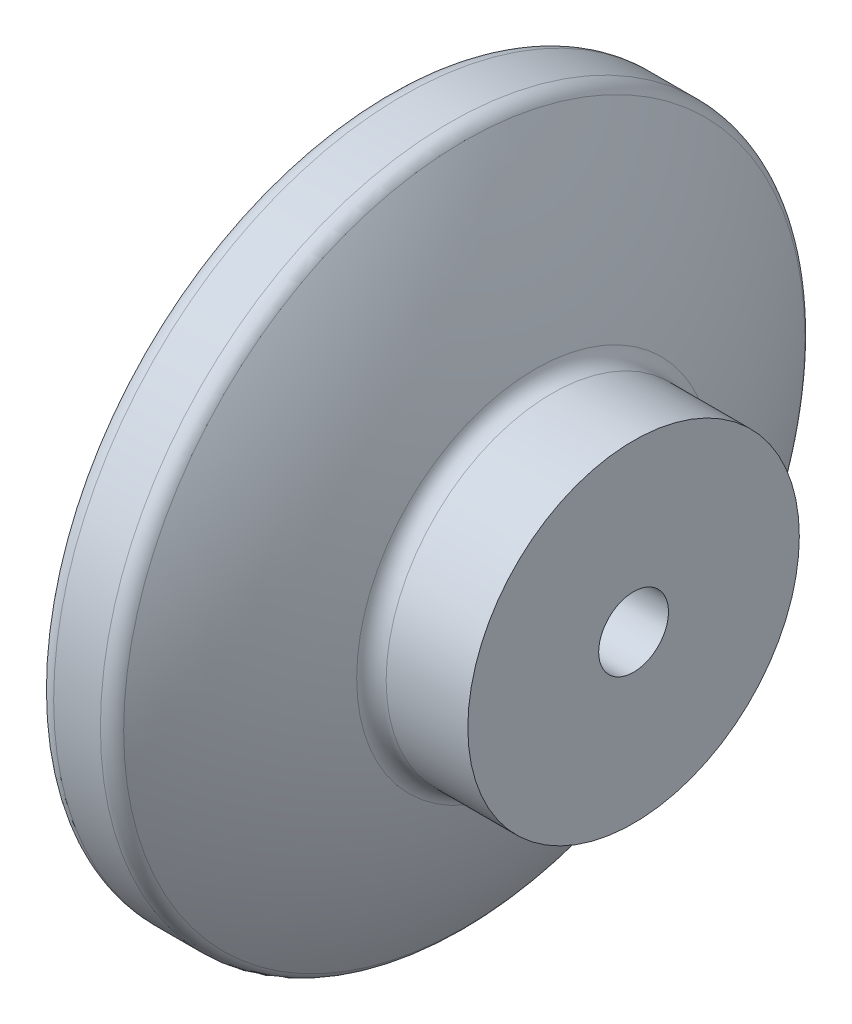
ISO-10303-21;
HEADER;
FILE_DESCRIPTION(('STEP AP214'),'2;1');
FILE_NAME('part.step','',(''),(''),'','','');
FILE_SCHEMA(('AUTOMOTIVE_DESIGN { 1 0 10303 214 1 1 1 1 }'));
ENDSEC;
DATA;
#1=APPLICATION_CONTEXT('core data for automotive mechanical design processes');
#2=APPLICATION_PROTOCOL_DEFINITION('international standard','automotive_design',2000,#1);
#3=PRODUCT_CONTEXT('',#1,'mechanical');
#4=PRODUCT('Part','Part','',(#3));
#5=PRODUCT_RELATED_PRODUCT_CATEGORY('part','',(#4));
#6=PRODUCT_DEFINITION_FORMATION('','',#4);
#7=PRODUCT_DEFINITION_CONTEXT('part definition',#1,'design');
#8=PRODUCT_DEFINITION('design','',#6,#7);
#9=PRODUCT_DEFINITION_SHAPE('','',#8);
#10=(LENGTH_UNIT() NAMED_UNIT(*) SI_UNIT(.MILLI.,.METRE.));
#11=(NAMED_UNIT(*) PLANE_ANGLE_UNIT() SI_UNIT($,.RADIAN.));
#12=(NAMED_UNIT(*) SI_UNIT($,.STERADIAN.) SOLID_ANGLE_UNIT());
#13=UNCERTAINTY_MEASURE_WITH_UNIT(LENGTH_MEASURE(1.E-05),#10,'distance_accuracy_value','');
#14=(GEOMETRIC_REPRESENTATION_CONTEXT(3) GLOBAL_UNCERTAINTY_ASSIGNED_CONTEXT((#13)) GLOBAL_UNIT_ASSIGNED_CONTEXT((#10,
#11,#12)) REPRESENTATION_CONTEXT('',''));
#15=CARTESIAN_POINT('',(0.,0.,0.));
#16=DIRECTION('',(0.,0.,1.));
#17=DIRECTION('',(1.,0.,0.));
#18=AXIS2_PLACEMENT_3D('',#15,#16,#17);
#19=CARTESIAN_POINT('',(-10.,0.,0.));
#20=DIRECTION('',(-1.,0.,0.));
#21=DIRECTION('',(0.,1.,0.));
#22=AXIS2_PLACEMENT_3D('',#19,#20,#21);
#23=SPHERICAL_SURFACE('',#22,75.);
#24=CARTESIAN_POINT('',(55.23065837761,0.,0.));
#25=DIRECTION('',(-1.,0.,0.));
#26=DIRECTION('',(0.,0.,1.));
#27=AXIS2_PLACEMENT_3D('',#24,#25,#26);
#28=CIRCLE('',#27,37.012987012987);
#29=CARTESIAN_POINT('',(55.23065837761,37.012987012987,0.));
#30=VERTEX_POINT('',#29);
#31=EDGE_CURVE('E10',#30,#30,#28,.T.);
#32=CARTESIAN_POINT('',(64.5721127500087,0.,0.));
#33=DIRECTION('',(-1.,0.,0.));
#34=DIRECTION('',(0.,0.,1.));
#35=AXIS2_PLACEMENT_3D('',#32,#33,#34);
#36=CIRCLE('',#35,8.);
#37=CARTESIAN_POINT('',(64.5721127500087,7.9999999999999,0.));
#38=VERTEX_POINT('',#37);
#39=EDGE_CURVE('E43',#38,#38,#36,.F.);
#40=CARTESIAN_POINT('',(55.23065837761,37.012987012987,0.));
#41=CARTESIAN_POINT('',(55.3884443950413,36.7349095697746,0.));
#42=CARTESIAN_POINT('',(55.5444520445442,36.4558230533568,0.));
#43=CARTESIAN_POINT('',(55.8528855538291,35.8956777746089,0.));
#44=CARTESIAN_POINT('',(56.0053114136109,35.6146190122787,0.));
#45=CARTESIAN_POINT('',(56.3065562895893,35.0505751422047,0.));
#46=CARTESIAN_POINT('',(56.4553753057859,34.7675900344608,0.));
#47=CARTESIAN_POINT('',(56.7493821876181,34.1997397755547,0.));
#48=CARTESIAN_POINT('',(56.8945700532538,33.9148746243924,0.));
#49=CARTESIAN_POINT('',(57.1812908788231,33.3433108649767,0.));
#50=CARTESIAN_POINT('',(57.3228238387566,33.0566122567231,0.));
#51=CARTESIAN_POINT('',(57.6022117068295,32.481428475529,0.));
#52=CARTESIAN_POINT('',(57.7400666149688,32.1929433025884,0.));
#53=CARTESIAN_POINT('',(58.0120758319065,31.6142335749641,0.));
#54=CARTESIAN_POINT('',(58.1462301407049,31.3240090202803,0.));
#55=CARTESIAN_POINT('',(58.410816217476,30.7418679970441,0.));
#56=CARTESIAN_POINT('',(58.5412479854487,30.4499515284916,0.));
#57=CARTESIAN_POINT('',(58.7983676477084,29.8644744219946,0.));
#58=CARTESIAN_POINT('',(58.9250555419954,29.5709137840501,0.));
#59=CARTESIAN_POINT('',(59.1746667364122,28.9821963521905,0.));
#60=CARTESIAN_POINT('',(59.297590036542,28.6870395582753,0.));
#61=CARTESIAN_POINT('',(59.5396519378772,28.0951780889472,0.));
#62=CARTESIAN_POINT('',(59.6587905390826,27.7984734135342,0.));
#63=CARTESIAN_POINT('',(59.8932635568133,27.2035647088495,0.));
#64=CARTESIAN_POINT('',(60.0085979733387,26.9053606795778,0.));
#65=CARTESIAN_POINT('',(60.2354437581477,26.3075020400419,0.));
#66=CARTESIAN_POINT('',(60.3469551264314,26.0078474297777,0.));
#67=CARTESIAN_POINT('',(60.5661365764754,25.4071366383731,0.));
#68=CARTESIAN_POINT('',(60.6738066582358,25.1060804572327,0.));
#69=CARTESIAN_POINT('',(60.8852879252149,24.5026157634268,0.));
#70=CARTESIAN_POINT('',(60.9890991104335,24.2002072507612,0.));
#71=CARTESIAN_POINT('',(61.1928456054536,23.5940873544367,0.));
#72=CARTESIAN_POINT('',(61.292780915255,23.2903759707778,0.));
#73=CARTESIAN_POINT('',(61.4887593144857,22.6817000060903,0.));
#74=CARTESIAN_POINT('',(61.5848024039149,22.3767354250616,0.));
#75=CARTESIAN_POINT('',(61.7729806540392,21.765602944225,0.));
#76=CARTESIAN_POINT('',(61.8651158147344,21.4594350444171,0.));
#77=CARTESIAN_POINT('',(62.0454631381917,20.8459460014219,0.));
#78=CARTESIAN_POINT('',(62.1336753009539,20.5386248582346,0.));
#79=CARTESIAN_POINT('',(62.3061622009736,19.9228795924997,0.));
#80=CARTESIAN_POINT('',(62.3904369382311,19.6144554699521,0.));
#81=CARTESIAN_POINT('',(62.5550352036567,18.9965546899135,0.));
#82=CARTESIAN_POINT('',(62.6353587318248,18.6870780324227,0.));
#83=CARTESIAN_POINT('',(62.7920414417287,18.0671227990626,0.));
#84=CARTESIAN_POINT('',(62.8684006234644,17.7566442231934,0.));
#85=CARTESIAN_POINT('',(63.0171421515494,17.1347359335105,0.));
#86=CARTESIAN_POINT('',(63.0895244978986,16.8233062196969,0.));
#87=CARTESIAN_POINT('',(63.2303005166939,16.1995465901233,0.));
#88=CARTESIAN_POINT('',(63.2986941891399,15.8872166743634,0.));
#89=CARTESIAN_POINT('',(63.4314816739633,15.2617077241262,0.));
#90=CARTESIAN_POINT('',(63.4958754863408,14.9485286896489,0.));
#91=CARTESIAN_POINT('',(63.6206527191261,14.3213727240915,0.));
#92=CARTESIAN_POINT('',(63.681036139534,14.0073957930115,0.));
#93=CARTESIAN_POINT('',(63.7977827121546,13.3786953868343,0.));
#94=CARTESIAN_POINT('',(63.8541458643673,13.0639719117371,0.));
#95=CARTESIAN_POINT('',(63.9628426828254,12.4338298923223,0.));
#96=CARTESIAN_POINT('',(64.0151763490709,12.1184113480048,0.));
#97=CARTESIAN_POINT('',(64.1158056334436,11.4869307782172,0.));
#98=CARTESIAN_POINT('',(64.1641012515709,11.1708687527471,0.));
#99=CARTESIAN_POINT('',(64.2566465507746,10.5381529155028,0.));
#100=CARTESIAN_POINT('',(64.300896231851,10.2214991037286,0.));
#101=CARTESIAN_POINT('',(64.3853423820833,9.58765147978233,0.));
#102=CARTESIAN_POINT('',(64.4255388512391,9.27045766761034,0.));
#103=CARTESIAN_POINT('',(64.5018721435973,8.63558193848603,0.));
#104=CARTESIAN_POINT('',(64.5380089667996,8.31790002153371,0.));
#105=CARTESIAN_POINT('',(64.5721127500087,7.9999999999999,0.));
#106=B_SPLINE_CURVE_WITH_KNOTS('',3,(#40,#41,#42,#43,#44,#45,#46,#47,#48,#49,#50,#51,#52,#53,
#54,#55,#56,#57,#58,#59,#60,#61,#62,#63,#64,#65,#66,#67,#68,#69,#70,#71,#72,#73,#74,#75,#76,#77,
#78,#79,#80,#81,#82,#83,#84,#85,#86,#87,#88,#89,#90,#91,#92,#93,#94,#95,#96,#97,#98,#99,#100,
#101,#102,#103,#104,#105),.UNSPECIFIED.,.F.,.F.,(4,2,2,2,2,2,2,2,2,2,2,2,2,2,2,2,2,2,2,2,2,2,2,
2,2,2,2,2,2,2,2,2,4),(0.,0.959165719475215,1.91833143895044,2.87749715842563,3.83666287790085,
4.79582859737606,5.75499431685126,6.71416003632647,7.67332575580169,8.63249147527691,
9.59165719475212,10.5508229142273,11.5099886337025,12.4691543531777,13.4283200726529,
14.3874857921282,15.3466515116034,16.3058172310786,17.2649829505538,18.224148670029,
19.1833143895042,20.1424801089794,21.1016458284546,22.0608115479298,23.0199772674051,
23.9791429868803,24.9383087063555,25.8974744258307,26.8566401453059,27.8158058647811,
28.7749715842563,29.7341373037315,30.6933030232067),.UNSPECIFIED.);
#107=EDGE_CURVE('BSEAM39',#30,#38,#106,.T.);
#108=ORIENTED_EDGE('',*,*,#31,.T.);
#109=ORIENTED_EDGE('',*,*,#39,.T.);
#110=ORIENTED_EDGE('',*,*,#107,.T.);
#111=ORIENTED_EDGE('',*,*,#107,.F.);
#112=EDGE_LOOP('',(#108,#110,#109,#111));
#113=FACE_BOUND('',#112,.T.);
#114=ADVANCED_FACE('F39',(#113),#23,.F.);
#115=CARTESIAN_POINT('',(0.,0.,0.));
#116=DIRECTION('',(-1.,0.,0.));
#117=DIRECTION('',(0.,1.,0.));
#118=AXIS2_PLACEMENT_3D('',#115,#116,#117);
#119=SPHERICAL_SURFACE('',#118,75.);
#120=CARTESIAN_POINT('',(72.1568539381252,0.,0.));
#121=DIRECTION('',(-1.,0.,0.));
#122=DIRECTION('',(0.,0.,1.));
#123=AXIS2_PLACEMENT_3D('',#120,#121,#122);
#124=CIRCLE('',#123,20.4545454545455);
#125=CARTESIAN_POINT('',(72.1568539381252,20.4545454545454,0.));
#126=VERTEX_POINT('',#125);
#127=EDGE_CURVE('E83',#126,#126,#124,.T.);
#128=CARTESIAN_POINT('',(64.0374330503319,0.,0.));
#129=DIRECTION('',(-1.,0.,0.));
#130=DIRECTION('',(0.,0.,1.));
#131=AXIS2_PLACEMENT_3D('',#128,#129,#130);
#132=CIRCLE('',#131,39.041095890411);
#133=CARTESIAN_POINT('',(64.0374330503319,39.041095890411,0.));
#134=VERTEX_POINT('',#133);
#135=EDGE_CURVE('E79',#134,#134,#132,.F.);
#136=CARTESIAN_POINT('',(72.1568539381252,20.4545454545454,0.));
#137=CARTESIAN_POINT('',(72.0990558192341,20.6584381379828,0.));
#138=CARTESIAN_POINT('',(72.0403934513344,20.8620858295005,0.));
#139=CARTESIAN_POINT('',(71.9213445307203,21.2688766231451,0.));
#140=CARTESIAN_POINT('',(71.8609579780058,21.4720197252719,0.));
#141=CARTESIAN_POINT('',(71.7384650009643,21.8777867345826,0.));
#142=CARTESIAN_POINT('',(71.6763585766372,22.0804106417665,0.));
#143=CARTESIAN_POINT('',(71.5504303263619,22.4851247026648,0.));
#144=CARTESIAN_POINT('',(71.4866085004136,22.6872148563792,0.));
#145=CARTESIAN_POINT('',(71.3572540312604,23.0908468875639,0.));
#146=CARTESIAN_POINT('',(71.2917213880555,23.2923887650343,0.));
#147=CARTESIAN_POINT('',(71.1589499940771,23.6949097610534,0.));
#148=CARTESIAN_POINT('',(71.0917112433035,23.8958888796022,0.));
#149=CARTESIAN_POINT('',(70.9555324658379,24.2972699153534,0.));
#150=CARTESIAN_POINT('',(70.8865924391459,24.4976718325559,0.));
#151=CARTESIAN_POINT('',(70.7470160639186,24.8978840647177,0.));
#152=CARTESIAN_POINT('',(70.6763797153834,25.0976943796771,0.));
#153=CARTESIAN_POINT('',(70.5334157723972,25.4967090489553,0.));
#154=CARTESIAN_POINT('',(70.4610881779461,25.695913403274,0.));
#155=CARTESIAN_POINT('',(70.314746940601,26.0937018364212,0.));
#156=CARTESIAN_POINT('',(70.2407332977069,26.2922859152496,0.));
#157=CARTESIAN_POINT('',(70.0910252821048,26.6888195271387,0.));
#158=CARTESIAN_POINT('',(70.0153309093968,26.8867690601994,0.));
#159=CARTESIAN_POINT('',(69.8622668735744,27.2820193558744,0.));
#160=CARTESIAN_POINT('',(69.7848972104599,27.4793201184886,0.));
#161=CARTESIAN_POINT('',(69.6284881536184,27.8732586952126,0.));
#162=CARTESIAN_POINT('',(69.5494487598914,28.0698965093224,0.));
#163=CARTESIAN_POINT('',(69.3897059216057,28.462495058619,0.));
#164=CARTESIAN_POINT('',(69.309002477047,28.6584557938058,0.));
#165=CARTESIAN_POINT('',(69.1459373364578,29.0496861034931,0.));
#166=CARTESIAN_POINT('',(69.0635756404273,29.2449556779935,0.));
#167=CARTESIAN_POINT('',(68.8971999154165,29.6347896342114,0.));
#168=CARTESIAN_POINT('',(68.8131858864362,29.8293540159289,0.));
#169=CARTESIAN_POINT('',(68.6435115327846,30.2177636051595,0.));
#170=CARTESIAN_POINT('',(68.5578512081133,30.4116088126726,0.));
#171=CARTESIAN_POINT('',(68.3848904186417,30.7985661237532,0.));
#172=CARTESIAN_POINT('',(68.2975899538413,30.9916782273207,0.));
#173=CARTESIAN_POINT('',(68.1213551575341,31.3771554534494,0.));
#174=CARTESIAN_POINT('',(68.0324208260272,31.5695205760107,0.));
#175=CARTESIAN_POINT('',(67.8529246871394,31.9534900167449,0.));
#176=CARTESIAN_POINT('',(67.7623628797584,32.1450943349178,0.));
#177=CARTESIAN_POINT('',(67.5796182969055,32.5275283981644,0.));
#178=CARTESIAN_POINT('',(67.4874355214335,32.718358143238,0.));
#179=CARTESIAN_POINT('',(67.3014556266644,33.0992293472363,0.));
#180=CARTESIAN_POINT('',(67.2076585073675,33.2892708061609,0.));
#181=CARTESIAN_POINT('',(67.0184566652213,33.6685517814574,0.));
#182=CARTESIAN_POINT('',(66.9230519423722,33.8577912978293,0.));
#183=CARTESIAN_POINT('',(66.7306417489179,34.2354547892449,0.));
#184=CARTESIAN_POINT('',(66.6336362783127,34.4238787642887,0.));
#185=CARTESIAN_POINT('',(66.4380315601697,34.7998976328758,0.));
#186=CARTESIAN_POINT('',(66.3394323126318,34.9874925264191,0.));
#187=CARTESIAN_POINT('',(66.1406471259864,35.3618397514174,0.));
#188=CARTESIAN_POINT('',(66.0404611868789,35.5485920828724,0.));
#189=CARTESIAN_POINT('',(65.8385098164364,35.9212407636283,0.));
#190=CARTESIAN_POINT('',(65.7367443851014,36.1071371129292,0.));
#191=CARTESIAN_POINT('',(65.5316413432014,36.4780604709139,0.));
#192=CARTESIAN_POINT('',(65.4283037326364,36.6630874795975,0.));
#193=CARTESIAN_POINT('',(65.22006375768,37.0322588600137,0.));
#194=CARTESIAN_POINT('',(65.1151613932886,37.2164032317462,0.));
#195=CARTESIAN_POINT('',(64.9037994506576,37.5837961066273,0.));
#196=CARTESIAN_POINT('',(64.797339872418,37.767044609776,0.));
#197=CARTESIAN_POINT('',(64.582871146016,38.1326325754764,0.));
#198=CARTESIAN_POINT('',(64.4748619978536,38.3149720380281,0.));
#199=CARTESIAN_POINT('',(64.2573019165704,38.678728833601,0.));
#200=CARTESIAN_POINT('',(64.1477509834496,38.8601461666221,0.));
#201=CARTESIAN_POINT('',(64.0374330503319,39.041095890411,0.));
#202=B_SPLINE_CURVE_WITH_KNOTS('',3,(#136,#137,#138,#139,#140,#141,#142,#143,#144,#145,#146,
#147,#148,#149,#150,#151,#152,#153,#154,#155,#156,#157,#158,#159,#160,#161,#162,#163,#164,#165,
#166,#167,#168,#169,#170,#171,#172,#173,#174,#175,#176,#177,#178,#179,#180,#181,#182,#183,#184,
#185,#186,#187,#188,#189,#190,#191,#192,#193,#194,#195,#196,#197,#198,#199,#200,#201),
.UNSPECIFIED.,.F.,.F.,(4,2,2,2,2,2,2,2,2,2,2,2,2,2,2,2,2,2,2,2,2,2,2,2,2,2,2,2,2,2,2,2,4),(0.,
0.635777648901161,1.27155529780232,1.90733294670348,2.54311059560464,3.17888824450581,
3.81466589340697,4.45044354230813,5.08622119120929,5.72199884011044,6.3577764890116,
6.99355413791276,7.62933178681392,8.26510943571509,8.90088708461625,9.53666473351741,
10.1724423824186,10.8082200313197,11.4439976802209,12.0797753291221,12.7155529780232,
13.3513306269244,13.9871082758255,14.6228859247267,15.2586635736279,15.894441222529,
16.5302188714302,17.1659965203313,17.8017741692325,18.4375518181337,19.0733294670348,
19.709107115936,20.3448847648372),.UNSPECIFIED.);
#203=EDGE_CURVE('BSEAM110',#126,#134,#202,.T.);
#204=ORIENTED_EDGE('',*,*,#127,.T.);
#205=ORIENTED_EDGE('',*,*,#135,.T.);
#206=ORIENTED_EDGE('',*,*,#203,.T.);
#207=ORIENTED_EDGE('',*,*,#203,.F.);
#208=EDGE_LOOP('',(#204,#206,#205,#207));
#209=FACE_BOUND('',#208,.T.);
#210=ADVANCED_FACE('F110',(#209),#119,.T.);
#211=CARTESIAN_POINT('',(-75.,0.,0.));
#212=DIRECTION('',(-1.,0.,0.));
#213=DIRECTION('',(0.,0.,1.));
#214=AXIS2_PLACEMENT_3D('',#211,#212,#213);
#215=CYLINDRICAL_SURFACE('',#214,40.);
#216=CARTESIAN_POINT('',(62.3297681689897,0.,0.));
#217=DIRECTION('',(-1.,0.,0.));
#218=DIRECTION('',(0.,0.,1.));
#219=AXIS2_PLACEMENT_3D('',#216,#217,#218);
#220=CIRCLE('',#219,40.);
#221=CARTESIAN_POINT('',(62.3297681689897,0.,40.));
#222=VERTEX_POINT('',#221);
#223=EDGE_CURVE('E48',#222,#222,#220,.T.);
#224=ORIENTED_EDGE('',*,*,#223,.T.);
#225=EDGE_LOOP('',(#224));
#226=FACE_BOUND('',#225,.T.);
#227=CARTESIAN_POINT('',(56.9701426010129,0.,0.));
#228=DIRECTION('',(-1.,0.,0.));
#229=DIRECTION('',(0.,0.,1.));
#230=AXIS2_PLACEMENT_3D('',#227,#228,#229);
#231=CIRCLE('',#230,40.);
#232=CARTESIAN_POINT('',(56.9701426010129,0.,40.));
#233=VERTEX_POINT('',#232);
#234=EDGE_CURVE('E54',#233,#233,#231,.F.);
#235=ORIENTED_EDGE('',*,*,#234,.T.);
#236=EDGE_LOOP('',(#235));
#237=FACE_BOUND('',#236,.T.);
#238=ADVANCED_FACE('F94',(#226,#237),#215,.T.);
#239=CARTESIAN_POINT('',(-75.,0.,0.));
#240=DIRECTION('',(-1.,0.,0.));
#241=DIRECTION('',(0.,0.,1.));
#242=AXIS2_PLACEMENT_3D('',#239,#240,#241);
#243=CYLINDRICAL_SURFACE('',#242,4.);
#244=CARTESIAN_POINT('',(70.,0.,0.));
#245=DIRECTION('',(1.,0.,0.));
#246=DIRECTION('',(0.,0.,-1.));
#247=AXIS2_PLACEMENT_3D('',#244,#245,#246);
#248=CIRCLE('',#247,4.);
#249=CARTESIAN_POINT('',(70.,0.,-4.));
#250=VERTEX_POINT('',#249);
#251=EDGE_CURVE('E57',#250,#250,#248,.F.);
#252=ORIENTED_EDGE('',*,*,#251,.T.);
#253=EDGE_LOOP('',(#252));
#254=FACE_BOUND('',#253,.T.);
#255=CARTESIAN_POINT('',(83.4428877022476,0.,0.));
#256=DIRECTION('',(-1.,0.,0.));
#257=DIRECTION('',(0.,0.,1.));
#258=AXIS2_PLACEMENT_3D('',#255,#256,#257);
#259=CIRCLE('',#258,4.);
#260=CARTESIAN_POINT('',(83.4428877022476,0.,4.));
#261=VERTEX_POINT('',#260);
#262=EDGE_CURVE('E75',#261,#261,#259,.T.);
#263=ORIENTED_EDGE('',*,*,#262,.F.);
#264=EDGE_LOOP('',(#263));
#265=FACE_BOUND('',#264,.T.);
#266=ADVANCED_FACE('F120',(#254,#265),#243,.F.);
#267=CARTESIAN_POINT('',(83.4428877022476,1.54400358613744E-13,0.));
#268=DIRECTION('',(-1.,0.,0.));
#269=DIRECTION('',(0.,0.,1.));
#270=AXIS2_PLACEMENT_3D('',#267,#268,#269);
#271=PLANE('',#270);
#272=CARTESIAN_POINT('',(83.4428877022476,0.,0.));
#273=DIRECTION('',(-1.,0.,0.));
#274=DIRECTION('',(0.,0.,1.));
#275=AXIS2_PLACEMENT_3D('',#272,#273,#274);
#276=CIRCLE('',#275,19.);
#277=CARTESIAN_POINT('',(83.4428877022476,0.,19.));
#278=VERTEX_POINT('',#277);
#279=EDGE_CURVE('E66',#278,#278,#276,.T.);
#280=ORIENTED_EDGE('',*,*,#279,.F.);
#281=EDGE_LOOP('',(#280));
#282=FACE_BOUND('',#281,.T.);
#283=ORIENTED_EDGE('',*,*,#262,.T.);
#284=EDGE_LOOP('',(#283));
#285=FACE_BOUND('',#284,.T.);
#286=ADVANCED_FACE('F131',(#282,#285),#271,.F.);
#287=CARTESIAN_POINT('',(-75.,0.,0.));
#288=DIRECTION('',(-1.,0.,0.));
#289=DIRECTION('',(0.,0.,1.));
#290=AXIS2_PLACEMENT_3D('',#287,#288,#289);
#291=CYLINDRICAL_SURFACE('',#290,19.);
#292=CARTESIAN_POINT('',(74.0810367098086,0.,0.));
#293=DIRECTION('',(-1.,0.,0.));
#294=DIRECTION('',(0.,0.,1.));
#295=AXIS2_PLACEMENT_3D('',#292,#293,#294);
#296=CIRCLE('',#295,19.);
#297=CARTESIAN_POINT('',(74.0810367098086,0.,19.));
#298=VERTEX_POINT('',#297);
#299=EDGE_CURVE('E87',#298,#298,#296,.F.);
#300=ORIENTED_EDGE('',*,*,#299,.T.);
#301=EDGE_LOOP('',(#300));
#302=FACE_BOUND('',#301,.T.);
#303=ORIENTED_EDGE('',*,*,#279,.T.);
#304=EDGE_LOOP('',(#303));
#305=FACE_BOUND('',#304,.T.);
#306=ADVANCED_FACE('F126',(#302,#305),#291,.T.);
#307=CARTESIAN_POINT('',(74.0810367098086,0.,0.));
#308=DIRECTION('',(-1.,0.,0.));
#309=DIRECTION('',(0.,0.,1.));
#310=AXIS2_PLACEMENT_3D('',#307,#308,#309);
#311=TOROIDAL_SURFACE('',#310,21.,2.);
#312=ORIENTED_EDGE('',*,*,#299,.F.);
#313=EDGE_LOOP('',(#312));
#314=FACE_BOUND('',#313,.T.);
#315=ORIENTED_EDGE('',*,*,#127,.F.);
#316=EDGE_LOOP('',(#315));
#317=FACE_BOUND('',#316,.T.);
#318=ADVANCED_FACE('F107',(#314,#317),#311,.F.);
#319=CARTESIAN_POINT('',(62.3297681689897,0.,0.));
#320=DIRECTION('',(-1.,0.,0.));
#321=DIRECTION('',(0.,0.,1.));
#322=AXIS2_PLACEMENT_3D('',#319,#320,#321);
#323=TOROIDAL_SURFACE('',#322,38.,2.);
#324=ORIENTED_EDGE('',*,*,#135,.F.);
#325=EDGE_LOOP('',(#324));
#326=FACE_BOUND('',#325,.T.);
#327=ORIENTED_EDGE('',*,*,#223,.F.);
#328=EDGE_LOOP('',(#327));
#329=FACE_BOUND('',#328,.T.);
#330=ADVANCED_FACE('F99',(#326,#329),#323,.T.);
#331=CARTESIAN_POINT('',(56.9701426010129,0.,0.));
#332=DIRECTION('',(-1.,0.,0.));
#333=DIRECTION('',(0.,0.,1.));
#334=AXIS2_PLACEMENT_3D('',#331,#332,#333);
#335=TOROIDAL_SURFACE('',#334,38.,2.);
#336=ORIENTED_EDGE('',*,*,#234,.F.);
#337=EDGE_LOOP('',(#336));
#338=FACE_BOUND('',#337,.T.);
#339=ORIENTED_EDGE('',*,*,#31,.F.);
#340=EDGE_LOOP('',(#339));
#341=FACE_BOUND('',#340,.T.);
#342=ADVANCED_FACE('F41',(#338,#341),#335,.T.);
#343=CARTESIAN_POINT('',(70.,0.,0.));
#344=DIRECTION('',(1.,0.,0.));
#345=DIRECTION('',(0.,0.,-1.));
#346=AXIS2_PLACEMENT_3D('',#343,#344,#345);
#347=PLANE('',#346);
#348=CARTESIAN_POINT('',(70.,0.,0.));
#349=DIRECTION('',(1.,0.,0.));
#350=DIRECTION('',(0.,0.,-1.));
#351=AXIS2_PLACEMENT_3D('',#348,#349,#350);
#352=CIRCLE('',#351,8.);
#353=CARTESIAN_POINT('',(70.,0.,-8.));
#354=VERTEX_POINT('',#353);
#355=EDGE_CURVE('E60',#354,#354,#352,.T.);
#356=ORIENTED_EDGE('',*,*,#355,.F.);
#357=EDGE_LOOP('',(#356));
#358=FACE_BOUND('',#357,.T.);
#359=ORIENTED_EDGE('',*,*,#251,.F.);
#360=EDGE_LOOP('',(#359));
#361=FACE_BOUND('',#360,.T.);
#362=ADVANCED_FACE('F98',(#358,#361),#347,.F.);
#363=CARTESIAN_POINT('',(70.,0.,0.));
#364=DIRECTION('',(-1.,0.,0.));
#365=DIRECTION('',(0.,0.,1.));
#366=AXIS2_PLACEMENT_3D('',#363,#364,#365);
#367=CYLINDRICAL_SURFACE('',#366,8.);
#368=ORIENTED_EDGE('',*,*,#39,.F.);
#369=EDGE_LOOP('',(#368));
#370=FACE_BOUND('',#369,.T.);
#371=ORIENTED_EDGE('',*,*,#355,.T.);
#372=EDGE_LOOP('',(#371));
#373=FACE_BOUND('',#372,.T.);
#374=ADVANCED_FACE('F104',(#370,#373),#367,.F.);
#375=CLOSED_SHELL('',(#114,#210,#238,#266,#286,#306,#318,#330,#342,#362,#374));
#376=MANIFOLD_SOLID_BREP('B2',#375);
#377=ADVANCED_BREP_SHAPE_REPRESENTATION('',(#18,#376),#14);
#378=SHAPE_DEFINITION_REPRESENTATION(#9,#377);
ENDSEC;
END-ISO-10303-21;
